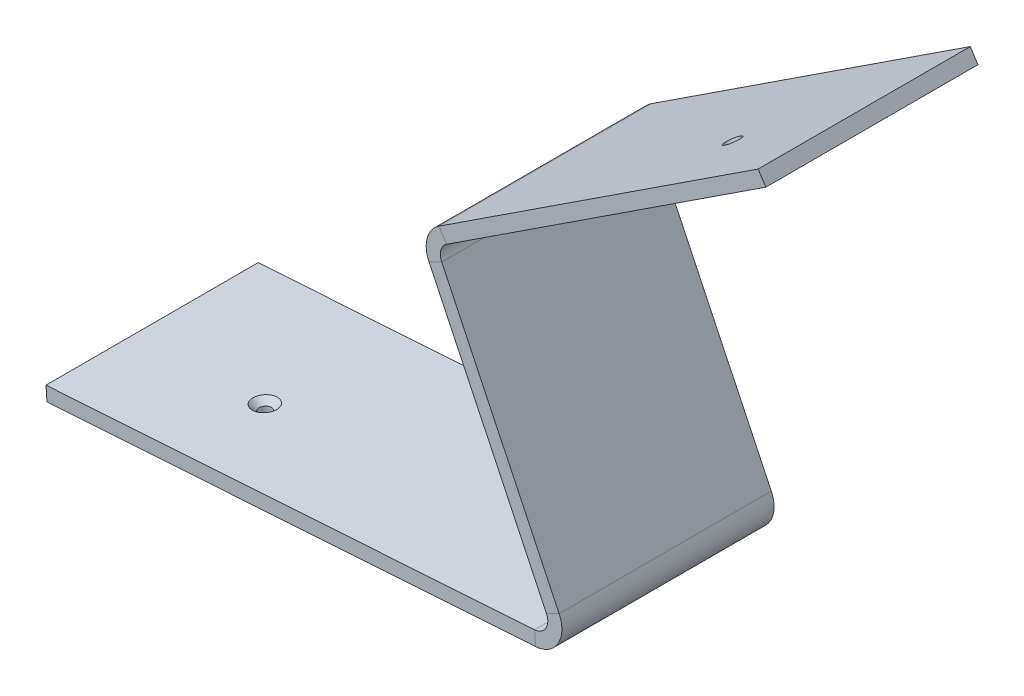
ISO-10303-21;
HEADER;
FILE_DESCRIPTION(('STEP AP214'),'2;1');
FILE_NAME('part.step','',(''),(''),'','','');
FILE_SCHEMA(('AUTOMOTIVE_DESIGN { 1 0 10303 214 1 1 1 1 }'));
ENDSEC;
DATA;
#1=APPLICATION_CONTEXT('core data for automotive mechanical design processes');
#2=APPLICATION_PROTOCOL_DEFINITION('international standard','automotive_design',2000,#1);
#3=PRODUCT_CONTEXT('',#1,'mechanical');
#4=PRODUCT('Part','Part','',(#3));
#5=PRODUCT_RELATED_PRODUCT_CATEGORY('part','',(#4));
#6=PRODUCT_DEFINITION_FORMATION('','',#4);
#7=PRODUCT_DEFINITION_CONTEXT('part definition',#1,'design');
#8=PRODUCT_DEFINITION('design','',#6,#7);
#9=PRODUCT_DEFINITION_SHAPE('','',#8);
#10=(LENGTH_UNIT() NAMED_UNIT(*) SI_UNIT(.MILLI.,.METRE.));
#11=(NAMED_UNIT(*) PLANE_ANGLE_UNIT() SI_UNIT($,.RADIAN.));
#12=(NAMED_UNIT(*) SI_UNIT($,.STERADIAN.) SOLID_ANGLE_UNIT());
#13=UNCERTAINTY_MEASURE_WITH_UNIT(LENGTH_MEASURE(1.E-05),#10,'distance_accuracy_value','');
#14=(GEOMETRIC_REPRESENTATION_CONTEXT(3) GLOBAL_UNCERTAINTY_ASSIGNED_CONTEXT((#13)) GLOBAL_UNIT_ASSIGNED_CONTEXT((#10,
#11,#12)) REPRESENTATION_CONTEXT('',''));
#15=CARTESIAN_POINT('',(0.,0.,0.));
#16=DIRECTION('',(0.,0.,1.));
#17=DIRECTION('',(1.,0.,0.));
#18=AXIS2_PLACEMENT_3D('',#15,#16,#17);
#19=CARTESIAN_POINT('',(50.2894061578181,-39.7342109267842,60.));
#20=DIRECTION('',(0.,0.,1.));
#21=DIRECTION('',(1.,0.,0.));
#22=AXIS2_PLACEMENT_3D('',#19,#20,#21);
#23=PLANE('',#22);
#24=DIRECTION('',(0.902204731894501,0.431308035801759,0.));
#25=VECTOR('',#24,1.);
#26=CARTESIAN_POINT('',(50.2894061578181,-39.7342109267842,60.));
#27=LINE('',#26,#25);
#28=CARTESIAN_POINT('',(50.2894061578181,-39.7342109267842,60.));
#29=VERTEX_POINT('',#28);
#30=CARTESIAN_POINT('',(53.8982250853961,-38.0089787835772,60.));
#31=VERTEX_POINT('',#30);
#32=EDGE_CURVE('E11',#29,#31,#27,.T.);
#33=ORIENTED_EDGE('',*,*,#32,.F.);
#34=CARTESIAN_POINT('',(46.6805872302401,-41.4594430699912,60.));
#35=DIRECTION('',(0.,0.,-1.));
#36=DIRECTION('',(-1.,0.,0.));
#37=AXIS2_PLACEMENT_3D('',#34,#35,#36);
#38=CIRCLE('',#37,4.);
#39=CARTESIAN_POINT('',(46.945285338165,-45.4506753247793,60.));
#40=VERTEX_POINT('',#39);
#41=EDGE_CURVE('E271',#40,#29,#38,.F.);
#42=ORIENTED_EDGE('',*,*,#41,.F.);
#43=DIRECTION('',(-0.0661745269812177,0.997808063697028,0.));
#44=VECTOR('',#43,1.);
#45=CARTESIAN_POINT('',(47.2099834460898,-49.4419075795675,60.));
#46=LINE('',#45,#44);
#47=CARTESIAN_POINT('',(47.2099834460898,-49.4419075795675,60.));
#48=VERTEX_POINT('',#47);
#49=EDGE_CURVE('E55',#48,#40,#46,.T.);
#50=ORIENTED_EDGE('',*,*,#49,.F.);
#51=CARTESIAN_POINT('',(46.6805872302401,-41.4594430699912,60.));
#52=DIRECTION('',(0.,0.,1.));
#53=DIRECTION('',(1.,0.,0.));
#54=AXIS2_PLACEMENT_3D('',#51,#52,#53);
#55=CIRCLE('',#54,8.);
#56=EDGE_CURVE('E157',#48,#31,#55,.T.);
#57=ORIENTED_EDGE('',*,*,#56,.T.);
#58=EDGE_LOOP('',(#33,#42,#50,#57));
#59=FACE_BOUND('',#58,.T.);
#60=ADVANCED_FACE('F46',(#59),#23,.T.);
#61=CARTESIAN_POINT('',(47.2099834460898,-49.4419075795675,60.));
#62=DIRECTION('',(0.,0.,1.));
#63=DIRECTION('',(1.,0.,0.));
#64=AXIS2_PLACEMENT_3D('',#61,#62,#63);
#65=PLANE('',#64);
#66=DIRECTION('',(-0.431308035801759,0.902204731894501,0.));
#67=VECTOR('',#66,1.);
#68=CARTESIAN_POINT('',(52.8354716674124,-45.0600387801869,60.));
#69=LINE('',#68,#67);
#70=CARTESIAN_POINT('',(17.0687583563425,29.7563228801671,60.));
#71=VERTEX_POINT('',#70);
#72=EDGE_CURVE('E151',#29,#71,#69,.T.);
#73=ORIENTED_EDGE('',*,*,#72,.F.);
#74=ORIENTED_EDGE('',*,*,#32,.T.);
#75=DIRECTION('',(-0.431308035801759,0.902204731894501,0.));
#76=VECTOR('',#75,1.);
#77=CARTESIAN_POINT('',(56.4442905949904,-43.3348066369798,60.));
#78=LINE('',#77,#76);
#79=CARTESIAN_POINT('',(20.6775772839205,31.4815550233742,60.));
#80=VERTEX_POINT('',#79);
#81=EDGE_CURVE('E148',#31,#80,#78,.T.);
#82=ORIENTED_EDGE('',*,*,#81,.T.);
#83=DIRECTION('',(-0.902204731894502,-0.431308035801757,0.));
#84=VECTOR('',#83,1.);
#85=CARTESIAN_POINT('',(20.6775772839205,31.4815550233742,60.));
#86=LINE('',#85,#84);
#87=EDGE_CURVE('E240',#80,#71,#86,.T.);
#88=ORIENTED_EDGE('',*,*,#87,.T.);
#89=EDGE_LOOP('',(#73,#74,#82,#88));
#90=FACE_BOUND('',#89,.T.);
#91=ADVANCED_FACE('F146',(#90),#65,.T.);
#92=CARTESIAN_POINT('',(46.945285338165,-45.4506753247793,0.));
#93=DIRECTION('',(0.,0.,-1.));
#94=DIRECTION('',(-1.,0.,0.));
#95=AXIS2_PLACEMENT_3D('',#92,#93,#94);
#96=PLANE('',#95);
#97=DIRECTION('',(0.0661745269812177,-0.997808063697028,0.));
#98=VECTOR('',#97,1.);
#99=CARTESIAN_POINT('',(46.945285338165,-45.4506753247793,0.));
#100=LINE('',#99,#98);
#101=CARTESIAN_POINT('',(46.945285338165,-45.4506753247793,0.));
#102=VERTEX_POINT('',#101);
#103=CARTESIAN_POINT('',(47.2099834460898,-49.4419075795675,0.));
#104=VERTEX_POINT('',#103);
#105=EDGE_CURVE('E245',#102,#104,#100,.T.);
#106=ORIENTED_EDGE('',*,*,#105,.F.);
#107=CARTESIAN_POINT('',(46.6805872302401,-41.4594430699912,0.));
#108=DIRECTION('',(0.,0.,-1.));
#109=DIRECTION('',(-1.,0.,0.));
#110=AXIS2_PLACEMENT_3D('',#107,#108,#109);
#111=CIRCLE('',#110,4.);
#112=CARTESIAN_POINT('',(50.2894061578181,-39.7342109267842,0.));
#113=VERTEX_POINT('',#112);
#114=EDGE_CURVE('E197',#102,#113,#111,.F.);
#115=ORIENTED_EDGE('',*,*,#114,.T.);
#116=DIRECTION('',(-0.902204731894501,-0.431308035801759,0.));
#117=VECTOR('',#116,1.);
#118=CARTESIAN_POINT('',(53.8982250853961,-38.0089787835772,0.));
#119=LINE('',#118,#117);
#120=CARTESIAN_POINT('',(53.8982250853961,-38.0089787835772,0.));
#121=VERTEX_POINT('',#120);
#122=EDGE_CURVE('E243',#121,#113,#119,.T.);
#123=ORIENTED_EDGE('',*,*,#122,.F.);
#124=CARTESIAN_POINT('',(46.6805872302401,-41.4594430699912,0.));
#125=DIRECTION('',(0.,0.,1.));
#126=DIRECTION('',(1.,0.,0.));
#127=AXIS2_PLACEMENT_3D('',#124,#125,#126);
#128=CIRCLE('',#127,8.);
#129=EDGE_CURVE('E169',#104,#121,#128,.T.);
#130=ORIENTED_EDGE('',*,*,#129,.F.);
#131=EDGE_LOOP('',(#106,#115,#123,#130));
#132=FACE_BOUND('',#131,.T.);
#133=ADVANCED_FACE('F289',(#132),#96,.T.);
#134=CARTESIAN_POINT('',(53.8982250853961,-38.0089787835772,0.));
#135=DIRECTION('',(0.,0.,-1.));
#136=DIRECTION('',(-1.,0.,0.));
#137=AXIS2_PLACEMENT_3D('',#134,#135,#136);
#138=PLANE('',#137);
#139=DIRECTION('',(0.997808063697029,0.0661745269812073,0.));
#140=VECTOR('',#139,1.);
#141=CARTESIAN_POINT('',(-91.2442365320208,-54.615390039187,0.));
#142=LINE('',#141,#140);
#143=CARTESIAN_POINT('',(-91.2442365320208,-54.615390039187,0.));
#144=VERTEX_POINT('',#143);
#145=EDGE_CURVE('E200',#144,#102,#142,.T.);
#146=ORIENTED_EDGE('',*,*,#145,.T.);
#147=ORIENTED_EDGE('',*,*,#105,.T.);
#148=DIRECTION('',(0.997808063697029,0.0661745269812073,0.));
#149=VECTOR('',#148,1.);
#150=CARTESIAN_POINT('',(-90.979538424096,-58.6066222939751,0.));
#151=LINE('',#150,#149);
#152=CARTESIAN_POINT('',(-90.979538424096,-58.6066222939751,0.));
#153=VERTEX_POINT('',#152);
#154=EDGE_CURVE('E206',#153,#104,#151,.T.);
#155=ORIENTED_EDGE('',*,*,#154,.F.);
#156=DIRECTION('',(-0.0661745269812074,0.997808063697029,0.));
#157=VECTOR('',#156,1.);
#158=CARTESIAN_POINT('',(-90.979538424096,-58.6066222939751,0.));
#159=LINE('',#158,#157);
#160=EDGE_CURVE('E203',#153,#144,#159,.T.);
#161=ORIENTED_EDGE('',*,*,#160,.T.);
#162=EDGE_LOOP('',(#146,#147,#155,#161));
#163=FACE_BOUND('',#162,.T.);
#164=ADVANCED_FACE('F338',(#163),#138,.T.);
#165=CARTESIAN_POINT('',(19.903130416915,39.8990947636686,60.));
#166=DIRECTION('',(0.,0.,1.));
#167=DIRECTION('',(1.,0.,0.));
#168=AXIS2_PLACEMENT_3D('',#165,#166,#167);
#169=PLANE('',#168);
#170=DIRECTION('',(0.547908224322945,-0.836538449635925,0.));
#171=VECTOR('',#170,1.);
#172=CARTESIAN_POINT('',(19.903130416915,39.8990947636686,60.));
#173=LINE('',#172,#171);
#174=CARTESIAN_POINT('',(19.903130416915,39.8990947636686,60.));
#175=VERTEX_POINT('',#174);
#176=CARTESIAN_POINT('',(22.0947633142068,36.5529409651249,60.));
#177=VERTEX_POINT('',#176);
#178=EDGE_CURVE('E64',#175,#177,#173,.T.);
#179=ORIENTED_EDGE('',*,*,#178,.F.);
#180=CARTESIAN_POINT('',(24.2863962114985,33.2067871665812,60.));
#181=DIRECTION('',(0.,0.,1.));
#182=DIRECTION('',(1.,0.,0.));
#183=AXIS2_PLACEMENT_3D('',#180,#181,#182);
#184=CIRCLE('',#183,8.);
#185=EDGE_CURVE('E267',#71,#175,#184,.F.);
#186=ORIENTED_EDGE('',*,*,#185,.F.);
#187=ORIENTED_EDGE('',*,*,#87,.F.);
#188=CARTESIAN_POINT('',(24.2863962114985,33.2067871665812,60.));
#189=DIRECTION('',(0.,0.,1.));
#190=DIRECTION('',(1.,0.,0.));
#191=AXIS2_PLACEMENT_3D('',#188,#189,#190);
#192=CIRCLE('',#191,4.);
#193=EDGE_CURVE('E177',#80,#177,#192,.F.);
#194=ORIENTED_EDGE('',*,*,#193,.T.);
#195=EDGE_LOOP('',(#179,#186,#187,#194));
#196=FACE_BOUND('',#195,.T.);
#197=ADVANCED_FACE('F343',(#196),#169,.T.);
#198=CARTESIAN_POINT('',(20.6775772839205,31.4815550233742,60.));
#199=DIRECTION('',(0.,0.,1.));
#200=DIRECTION('',(1.,0.,0.));
#201=AXIS2_PLACEMENT_3D('',#198,#199,#200);
#202=PLANE('',#201);
#203=DIRECTION('',(0.836538449635925,0.547908224322945,0.));
#204=VECTOR('',#203,1.);
#205=CARTESIAN_POINT('',(14.0519871455884,36.0667670070103,60.));
#206=LINE('',#205,#204);
#207=CARTESIAN_POINT('',(110.167579221413,99.0196694192464,60.));
#208=VERTEX_POINT('',#207);
#209=EDGE_CURVE('E264',#175,#208,#206,.T.);
#210=ORIENTED_EDGE('',*,*,#209,.F.);
#211=ORIENTED_EDGE('',*,*,#178,.T.);
#212=DIRECTION('',(0.836538449635925,0.547908224322945,0.));
#213=VECTOR('',#212,1.);
#214=CARTESIAN_POINT('',(16.2436200428802,32.7206132084666,60.));
#215=LINE('',#214,#213);
#216=CARTESIAN_POINT('',(112.359212118705,95.6735156207027,60.));
#217=VERTEX_POINT('',#216);
#218=EDGE_CURVE('E118',#177,#217,#215,.T.);
#219=ORIENTED_EDGE('',*,*,#218,.T.);
#220=DIRECTION('',(0.547908224322946,-0.836538449635924,0.));
#221=VECTOR('',#220,1.);
#222=CARTESIAN_POINT('',(110.167579221413,99.0196694192464,60.));
#223=LINE('',#222,#221);
#224=EDGE_CURVE('E261',#208,#217,#223,.T.);
#225=ORIENTED_EDGE('',*,*,#224,.F.);
#226=EDGE_LOOP('',(#210,#211,#219,#225));
#227=FACE_BOUND('',#226,.T.);
#228=ADVANCED_FACE('F316',(#227),#202,.T.);
#229=CARTESIAN_POINT('',(17.0687583563425,29.7563228801671,0.));
#230=DIRECTION('',(0.,0.,-1.));
#231=DIRECTION('',(-1.,0.,0.));
#232=AXIS2_PLACEMENT_3D('',#229,#230,#231);
#233=PLANE('',#232);
#234=DIRECTION('',(0.902204731894502,0.431308035801757,0.));
#235=VECTOR('',#234,1.);
#236=CARTESIAN_POINT('',(17.0687583563425,29.7563228801671,0.));
#237=LINE('',#236,#235);
#238=CARTESIAN_POINT('',(17.0687583563425,29.7563228801671,0.));
#239=VERTEX_POINT('',#238);
#240=CARTESIAN_POINT('',(20.6775772839205,31.4815550233742,0.));
#241=VERTEX_POINT('',#240);
#242=EDGE_CURVE('E105',#239,#241,#237,.T.);
#243=ORIENTED_EDGE('',*,*,#242,.F.);
#244=CARTESIAN_POINT('',(24.2863962114985,33.2067871665812,0.));
#245=DIRECTION('',(0.,0.,1.));
#246=DIRECTION('',(1.,0.,0.));
#247=AXIS2_PLACEMENT_3D('',#244,#245,#246);
#248=CIRCLE('',#247,8.);
#249=CARTESIAN_POINT('',(19.903130416915,39.8990947636686,0.));
#250=VERTEX_POINT('',#249);
#251=EDGE_CURVE('E193',#239,#250,#248,.F.);
#252=ORIENTED_EDGE('',*,*,#251,.T.);
#253=DIRECTION('',(-0.547908224322945,0.836538449635925,0.));
#254=VECTOR('',#253,1.);
#255=CARTESIAN_POINT('',(22.0947633142068,36.5529409651249,0.));
#256=LINE('',#255,#254);
#257=CARTESIAN_POINT('',(22.0947633142068,36.5529409651249,0.));
#258=VERTEX_POINT('',#257);
#259=EDGE_CURVE('E112',#258,#250,#256,.T.);
#260=ORIENTED_EDGE('',*,*,#259,.F.);
#261=CARTESIAN_POINT('',(24.2863962114985,33.2067871665812,0.));
#262=DIRECTION('',(0.,0.,1.));
#263=DIRECTION('',(1.,0.,0.));
#264=AXIS2_PLACEMENT_3D('',#261,#262,#263);
#265=CIRCLE('',#264,4.);
#266=EDGE_CURVE('E212',#241,#258,#265,.F.);
#267=ORIENTED_EDGE('',*,*,#266,.F.);
#268=EDGE_LOOP('',(#243,#252,#260,#267));
#269=FACE_BOUND('',#268,.T.);
#270=ADVANCED_FACE('F304',(#269),#233,.T.);
#271=CARTESIAN_POINT('',(22.0947633142068,36.5529409651249,0.));
#272=DIRECTION('',(0.,0.,-1.));
#273=DIRECTION('',(-1.,0.,0.));
#274=AXIS2_PLACEMENT_3D('',#271,#272,#273);
#275=PLANE('',#274);
#276=DIRECTION('',(-0.431308035801759,0.902204731894501,0.));
#277=VECTOR('',#276,1.);
#278=CARTESIAN_POINT('',(52.8354716674124,-45.0600387801869,0.));
#279=LINE('',#278,#277);
#280=EDGE_CURVE('E195',#113,#239,#279,.T.);
#281=ORIENTED_EDGE('',*,*,#280,.T.);
#282=ORIENTED_EDGE('',*,*,#242,.T.);
#283=DIRECTION('',(-0.431308035801759,0.902204731894501,0.));
#284=VECTOR('',#283,1.);
#285=CARTESIAN_POINT('',(56.4442905949904,-43.3348066369798,0.));
#286=LINE('',#285,#284);
#287=EDGE_CURVE('E210',#121,#241,#286,.T.);
#288=ORIENTED_EDGE('',*,*,#287,.F.);
#289=ORIENTED_EDGE('',*,*,#122,.T.);
#290=EDGE_LOOP('',(#281,#282,#288,#289));
#291=FACE_BOUND('',#290,.T.);
#292=ADVANCED_FACE('F291',(#291),#275,.T.);
#293=CARTESIAN_POINT('',(16.2436200428802,32.7206132084666,60.));
#294=DIRECTION('',(-0.547908224322945,0.836538449635925,0.));
#295=DIRECTION('',(-0.836538449635925,-0.547908224322945,0.));
#296=AXIS2_PLACEMENT_3D('',#293,#294,#295);
#297=PLANE('',#296);
#298=CARTESIAN_POINT('',(81.7247362595311,75.608829677852,36.598273193193));
#299=DIRECTION('',(0.547908224322945,-0.836538449635925,0.));
#300=DIRECTION('',(0.836538449635925,0.547908224322945,0.));
#301=AXIS2_PLACEMENT_3D('',#298,#299,#300);
#302=CIRCLE('',#301,4.7);
#303=CARTESIAN_POINT('',(85.65646697282,78.1839983321698,36.598273193193));
#304=VERTEX_POINT('',#303);
#305=EDGE_CURVE('E360',#304,#304,#302,.T.);
#306=ORIENTED_EDGE('',*,*,#305,.F.);
#307=EDGE_LOOP('',(#306));
#308=FACE_BOUND('',#307,.T.);
#309=DIRECTION('',(0.836538449635925,0.547908224322945,0.));
#310=VECTOR('',#309,1.);
#311=CARTESIAN_POINT('',(16.2436200428802,32.7206132084666,0.));
#312=LINE('',#311,#310);
#313=CARTESIAN_POINT('',(112.359212118705,95.6735156207027,0.));
#314=VERTEX_POINT('',#313);
#315=EDGE_CURVE('E183',#258,#314,#312,.T.);
#316=ORIENTED_EDGE('',*,*,#315,.T.);
#317=DIRECTION('',(0.,0.,-1.));
#318=VECTOR('',#317,1.);
#319=CARTESIAN_POINT('',(112.359212118705,95.6735156207027,60.));
#320=LINE('',#319,#318);
#321=EDGE_CURVE('E236',#217,#314,#320,.T.);
#322=ORIENTED_EDGE('',*,*,#321,.F.);
#323=ORIENTED_EDGE('',*,*,#218,.F.);
#324=DIRECTION('',(0.,0.,-1.));
#325=VECTOR('',#324,1.);
#326=CARTESIAN_POINT('',(22.0947633142068,36.5529409651249,60.));
#327=LINE('',#326,#325);
#328=EDGE_CURVE('E179',#177,#258,#327,.T.);
#329=ORIENTED_EDGE('',*,*,#328,.T.);
#330=EDGE_LOOP('',(#316,#322,#323,#329));
#331=FACE_BOUND('',#330,.T.);
#332=ADVANCED_FACE('F310',(#308,#331),#297,.F.);
#333=CARTESIAN_POINT('',(110.167579221413,99.0196694192464,60.));
#334=DIRECTION('',(0.836538449635925,0.547908224322946,0.));
#335=DIRECTION('',(-0.547908224322946,0.836538449635925,0.));
#336=AXIS2_PLACEMENT_3D('',#333,#334,#335);
#337=PLANE('',#336);
#338=DIRECTION('',(0.547908224322946,-0.836538449635924,0.));
#339=VECTOR('',#338,1.);
#340=CARTESIAN_POINT('',(110.167579221413,99.0196694192464,0.));
#341=LINE('',#340,#339);
#342=CARTESIAN_POINT('',(110.167579221413,99.0196694192464,0.));
#343=VERTEX_POINT('',#342);
#344=EDGE_CURVE('E186',#343,#314,#341,.T.);
#345=ORIENTED_EDGE('',*,*,#344,.F.);
#346=DIRECTION('',(0.,0.,-1.));
#347=VECTOR('',#346,1.);
#348=CARTESIAN_POINT('',(110.167579221413,99.0196694192464,60.));
#349=LINE('',#348,#347);
#350=EDGE_CURVE('E234',#208,#343,#349,.T.);
#351=ORIENTED_EDGE('',*,*,#350,.F.);
#352=ORIENTED_EDGE('',*,*,#224,.T.);
#353=ORIENTED_EDGE('',*,*,#321,.T.);
#354=EDGE_LOOP('',(#345,#351,#352,#353));
#355=FACE_BOUND('',#354,.T.);
#356=ADVANCED_FACE('F315',(#355),#337,.T.);
#357=CARTESIAN_POINT('',(14.0519871455884,36.0667670070103,60.));
#358=DIRECTION('',(-0.547908224322945,0.836538449635925,0.));
#359=DIRECTION('',(-0.836538449635925,-0.547908224322945,0.));
#360=AXIS2_PLACEMENT_3D('',#357,#358,#359);
#361=PLANE('',#360);
#362=CARTESIAN_POINT('',(79.5331033622394,78.9549834763957,36.598273193193));
#363=DIRECTION('',(-0.547908224322945,0.836538449635925,0.));
#364=DIRECTION('',(-0.836538449635925,-0.547908224322945,0.));
#365=AXIS2_PLACEMENT_3D('',#362,#363,#364);
#366=CIRCLE('',#365,2.24999999999999);
#367=CARTESIAN_POINT('',(77.6508918505586,77.7221899716691,36.598273193193));
#368=VERTEX_POINT('',#367);
#369=EDGE_CURVE('E49',#368,#368,#366,.T.);
#370=ORIENTED_EDGE('',*,*,#369,.F.);
#371=EDGE_LOOP('',(#370));
#372=FACE_BOUND('',#371,.T.);
#373=DIRECTION('',(0.836538449635925,0.547908224322945,0.));
#374=VECTOR('',#373,1.);
#375=CARTESIAN_POINT('',(14.0519871455884,36.0667670070103,0.));
#376=LINE('',#375,#374);
#377=EDGE_CURVE('E190',#250,#343,#376,.T.);
#378=ORIENTED_EDGE('',*,*,#377,.F.);
#379=DIRECTION('',(0.,0.,-1.));
#380=VECTOR('',#379,1.);
#381=CARTESIAN_POINT('',(19.903130416915,39.8990947636686,60.));
#382=LINE('',#381,#380);
#383=EDGE_CURVE('E231',#175,#250,#382,.T.);
#384=ORIENTED_EDGE('',*,*,#383,.F.);
#385=ORIENTED_EDGE('',*,*,#209,.T.);
#386=ORIENTED_EDGE('',*,*,#350,.T.);
#387=EDGE_LOOP('',(#378,#384,#385,#386));
#388=FACE_BOUND('',#387,.T.);
#389=ADVANCED_FACE('F318',(#372,#388),#361,.T.);
#390=CARTESIAN_POINT('',(24.2863962114985,33.2067871665812,60.));
#391=DIRECTION('',(0.,0.,-1.));
#392=DIRECTION('',(-1.,0.,0.));
#393=AXIS2_PLACEMENT_3D('',#390,#391,#392);
#394=CYLINDRICAL_SURFACE('',#393,8.);
#395=ORIENTED_EDGE('',*,*,#251,.F.);
#396=DIRECTION('',(0.,0.,-1.));
#397=VECTOR('',#396,1.);
#398=CARTESIAN_POINT('',(17.0687583563425,29.7563228801671,60.));
#399=LINE('',#398,#397);
#400=EDGE_CURVE('E228',#71,#239,#399,.T.);
#401=ORIENTED_EDGE('',*,*,#400,.F.);
#402=ORIENTED_EDGE('',*,*,#185,.T.);
#403=ORIENTED_EDGE('',*,*,#383,.T.);
#404=EDGE_LOOP('',(#395,#401,#402,#403));
#405=FACE_BOUND('',#404,.T.);
#406=ADVANCED_FACE('F301',(#405),#394,.T.);
#407=CARTESIAN_POINT('',(52.8354716674124,-45.0600387801869,60.));
#408=DIRECTION('',(-0.902204731894501,-0.431308035801759,0.));
#409=DIRECTION('',(0.431308035801759,-0.902204731894501,0.));
#410=AXIS2_PLACEMENT_3D('',#407,#408,#409);
#411=PLANE('',#410);
#412=ORIENTED_EDGE('',*,*,#280,.F.);
#413=DIRECTION('',(0.,0.,-1.));
#414=VECTOR('',#413,1.);
#415=CARTESIAN_POINT('',(50.2894061578181,-39.7342109267842,60.));
#416=LINE('',#415,#414);
#417=EDGE_CURVE('E225',#29,#113,#416,.T.);
#418=ORIENTED_EDGE('',*,*,#417,.F.);
#419=ORIENTED_EDGE('',*,*,#72,.T.);
#420=ORIENTED_EDGE('',*,*,#400,.T.);
#421=EDGE_LOOP('',(#412,#418,#419,#420));
#422=FACE_BOUND('',#421,.T.);
#423=ADVANCED_FACE('F296',(#422),#411,.T.);
#424=CARTESIAN_POINT('',(46.6805872302401,-41.4594430699912,60.));
#425=DIRECTION('',(0.,0.,-1.));
#426=DIRECTION('',(-1.,0.,0.));
#427=AXIS2_PLACEMENT_3D('',#424,#425,#426);
#428=CYLINDRICAL_SURFACE('',#427,4.);
#429=ORIENTED_EDGE('',*,*,#114,.F.);
#430=DIRECTION('',(0.,0.,-1.));
#431=VECTOR('',#430,1.);
#432=CARTESIAN_POINT('',(46.945285338165,-45.4506753247793,60.));
#433=LINE('',#432,#431);
#434=EDGE_CURVE('E222',#40,#102,#433,.T.);
#435=ORIENTED_EDGE('',*,*,#434,.F.);
#436=ORIENTED_EDGE('',*,*,#41,.T.);
#437=ORIENTED_EDGE('',*,*,#417,.T.);
#438=EDGE_LOOP('',(#429,#435,#436,#437));
#439=FACE_BOUND('',#438,.T.);
#440=ADVANCED_FACE('F294',(#439),#428,.F.);
#441=CARTESIAN_POINT('',(-91.2442365320208,-54.615390039187,60.));
#442=DIRECTION('',(-0.0661745269812073,0.997808063697029,0.));
#443=DIRECTION('',(-0.997808063697029,-0.0661745269812073,0.));
#444=AXIS2_PLACEMENT_3D('',#441,#442,#443);
#445=PLANE('',#444);
#446=CARTESIAN_POINT('',(-53.2288613209065,-52.0942143099714,36.126961684234));
#447=DIRECTION('',(-0.0661745269812073,0.997808063697029,0.));
#448=DIRECTION('',(-0.997808063697029,-0.0661745269812073,0.));
#449=AXIS2_PLACEMENT_3D('',#446,#447,#448);
#450=CIRCLE('',#449,3.36);
#451=CARTESIAN_POINT('',(-56.5814964149285,-52.3165607206282,36.126961684234));
#452=VERTEX_POINT('',#451);
#453=EDGE_CURVE('E252',#452,#452,#450,.T.);
#454=ORIENTED_EDGE('',*,*,#453,.F.);
#455=EDGE_LOOP('',(#454));
#456=FACE_BOUND('',#455,.T.);
#457=ORIENTED_EDGE('',*,*,#145,.F.);
#458=DIRECTION('',(0.,0.,-1.));
#459=VECTOR('',#458,1.);
#460=CARTESIAN_POINT('',(-91.2442365320208,-54.615390039187,60.));
#461=LINE('',#460,#459);
#462=CARTESIAN_POINT('',(-91.2442365320208,-54.615390039187,60.));
#463=VERTEX_POINT('',#462);
#464=EDGE_CURVE('E220',#463,#144,#461,.T.);
#465=ORIENTED_EDGE('',*,*,#464,.F.);
#466=DIRECTION('',(0.997808063697029,0.0661745269812073,0.));
#467=VECTOR('',#466,1.);
#468=CARTESIAN_POINT('',(-91.2442365320208,-54.615390039187,60.));
#469=LINE('',#468,#467);
#470=EDGE_CURVE('E273',#463,#40,#469,.T.);
#471=ORIENTED_EDGE('',*,*,#470,.T.);
#472=ORIENTED_EDGE('',*,*,#434,.T.);
#473=EDGE_LOOP('',(#457,#465,#471,#472));
#474=FACE_BOUND('',#473,.T.);
#475=ADVANCED_FACE('F401',(#456,#474),#445,.T.);
#476=CARTESIAN_POINT('',(-90.979538424096,-58.6066222939751,60.));
#477=DIRECTION('',(-0.997808063697029,-0.0661745269812074,0.));
#478=DIRECTION('',(0.0661745269812074,-0.997808063697029,0.));
#479=AXIS2_PLACEMENT_3D('',#476,#477,#478);
#480=PLANE('',#479);
#481=ORIENTED_EDGE('',*,*,#160,.F.);
#482=DIRECTION('',(0.,0.,-1.));
#483=VECTOR('',#482,1.);
#484=CARTESIAN_POINT('',(-90.979538424096,-58.6066222939751,60.));
#485=LINE('',#484,#483);
#486=CARTESIAN_POINT('',(-90.979538424096,-58.6066222939751,60.));
#487=VERTEX_POINT('',#486);
#488=EDGE_CURVE('E218',#487,#153,#485,.T.);
#489=ORIENTED_EDGE('',*,*,#488,.F.);
#490=DIRECTION('',(-0.0661745269812074,0.997808063697029,0.));
#491=VECTOR('',#490,1.);
#492=CARTESIAN_POINT('',(-90.979538424096,-58.6066222939751,60.));
#493=LINE('',#492,#491);
#494=EDGE_CURVE('E276',#487,#463,#493,.T.);
#495=ORIENTED_EDGE('',*,*,#494,.T.);
#496=ORIENTED_EDGE('',*,*,#464,.T.);
#497=EDGE_LOOP('',(#481,#489,#495,#496));
#498=FACE_BOUND('',#497,.T.);
#499=ADVANCED_FACE('F398',(#498),#480,.T.);
#500=CARTESIAN_POINT('',(-90.979538424096,-58.6066222939751,60.));
#501=DIRECTION('',(-0.0661745269812073,0.997808063697029,0.));
#502=DIRECTION('',(-0.997808063697029,-0.0661745269812073,0.));
#503=AXIS2_PLACEMENT_3D('',#500,#501,#502);
#504=PLANE('',#503);
#505=CARTESIAN_POINT('',(-52.9641632129817,-56.0854465647594,36.126961684234));
#506=DIRECTION('',(-0.0661745269812073,0.997808063697029,0.));
#507=DIRECTION('',(-0.997808063697029,-0.0661745269812073,0.));
#508=AXIS2_PLACEMENT_3D('',#505,#506,#507);
#509=CIRCLE('',#508,1.69999999999999);
#510=CARTESIAN_POINT('',(-54.6604369212666,-56.1979432606275,36.126961684234));
#511=VERTEX_POINT('',#510);
#512=EDGE_CURVE('E187',#511,#511,#509,.T.);
#513=ORIENTED_EDGE('',*,*,#512,.T.);
#514=EDGE_LOOP('',(#513));
#515=FACE_BOUND('',#514,.T.);
#516=ORIENTED_EDGE('',*,*,#154,.T.);
#517=DIRECTION('',(0.,0.,-1.));
#518=VECTOR('',#517,1.);
#519=CARTESIAN_POINT('',(47.2099834460898,-49.4419075795675,60.));
#520=LINE('',#519,#518);
#521=EDGE_CURVE('E171',#48,#104,#520,.T.);
#522=ORIENTED_EDGE('',*,*,#521,.F.);
#523=DIRECTION('',(0.997808063697029,0.0661745269812073,0.));
#524=VECTOR('',#523,1.);
#525=CARTESIAN_POINT('',(-90.979538424096,-58.6066222939751,60.));
#526=LINE('',#525,#524);
#527=EDGE_CURVE('E162',#487,#48,#526,.T.);
#528=ORIENTED_EDGE('',*,*,#527,.F.);
#529=ORIENTED_EDGE('',*,*,#488,.T.);
#530=EDGE_LOOP('',(#516,#522,#528,#529));
#531=FACE_BOUND('',#530,.T.);
#532=ADVANCED_FACE('F286',(#515,#531),#504,.F.);
#533=CARTESIAN_POINT('',(46.6805872302401,-41.4594430699912,60.));
#534=DIRECTION('',(0.,0.,-1.));
#535=DIRECTION('',(-1.,0.,0.));
#536=AXIS2_PLACEMENT_3D('',#533,#534,#535);
#537=CYLINDRICAL_SURFACE('',#536,8.);
#538=ORIENTED_EDGE('',*,*,#129,.T.);
#539=DIRECTION('',(0.,0.,-1.));
#540=VECTOR('',#539,1.);
#541=CARTESIAN_POINT('',(53.8982250853961,-38.0089787835772,60.));
#542=LINE('',#541,#540);
#543=EDGE_CURVE('E166',#31,#121,#542,.T.);
#544=ORIENTED_EDGE('',*,*,#543,.F.);
#545=ORIENTED_EDGE('',*,*,#56,.F.);
#546=ORIENTED_EDGE('',*,*,#521,.T.);
#547=EDGE_LOOP('',(#538,#544,#545,#546));
#548=FACE_BOUND('',#547,.T.);
#549=ADVANCED_FACE('F167',(#548),#537,.T.);
#550=CARTESIAN_POINT('',(56.4442905949904,-43.3348066369798,60.));
#551=DIRECTION('',(-0.902204731894501,-0.431308035801759,0.));
#552=DIRECTION('',(0.431308035801759,-0.902204731894501,0.));
#553=AXIS2_PLACEMENT_3D('',#550,#551,#552);
#554=PLANE('',#553);
#555=ORIENTED_EDGE('',*,*,#287,.T.);
#556=DIRECTION('',(0.,0.,-1.));
#557=VECTOR('',#556,1.);
#558=CARTESIAN_POINT('',(20.6775772839205,31.4815550233742,60.));
#559=LINE('',#558,#557);
#560=EDGE_CURVE('E172',#80,#241,#559,.T.);
#561=ORIENTED_EDGE('',*,*,#560,.F.);
#562=ORIENTED_EDGE('',*,*,#81,.F.);
#563=ORIENTED_EDGE('',*,*,#543,.T.);
#564=EDGE_LOOP('',(#555,#561,#562,#563));
#565=FACE_BOUND('',#564,.T.);
#566=ADVANCED_FACE('F174',(#565),#554,.F.);
#567=CARTESIAN_POINT('',(24.2863962114985,33.2067871665812,60.));
#568=DIRECTION('',(0.,0.,-1.));
#569=DIRECTION('',(-1.,0.,0.));
#570=AXIS2_PLACEMENT_3D('',#567,#568,#569);
#571=CYLINDRICAL_SURFACE('',#570,4.);
#572=ORIENTED_EDGE('',*,*,#266,.T.);
#573=ORIENTED_EDGE('',*,*,#328,.F.);
#574=ORIENTED_EDGE('',*,*,#193,.F.);
#575=ORIENTED_EDGE('',*,*,#560,.T.);
#576=EDGE_LOOP('',(#572,#573,#574,#575));
#577=FACE_BOUND('',#576,.T.);
#578=ADVANCED_FACE('F307',(#577),#571,.F.);
#579=CARTESIAN_POINT('',(24.2863962114985,33.2067871665812,60.));
#580=DIRECTION('',(0.,0.,1.));
#581=DIRECTION('',(1.,0.,0.));
#582=AXIS2_PLACEMENT_3D('',#579,#580,#581);
#583=PLANE('',#582);
#584=ORIENTED_EDGE('',*,*,#527,.T.);
#585=ORIENTED_EDGE('',*,*,#49,.T.);
#586=ORIENTED_EDGE('',*,*,#470,.F.);
#587=ORIENTED_EDGE('',*,*,#494,.F.);
#588=EDGE_LOOP('',(#584,#585,#586,#587));
#589=FACE_BOUND('',#588,.T.);
#590=ADVANCED_FACE('F282',(#589),#583,.T.);
#591=CARTESIAN_POINT('',(24.2863962114985,33.2067871665812,0.));
#592=DIRECTION('',(0.,0.,1.));
#593=DIRECTION('',(1.,0.,0.));
#594=AXIS2_PLACEMENT_3D('',#591,#592,#593);
#595=PLANE('',#594);
#596=ORIENTED_EDGE('',*,*,#315,.F.);
#597=ORIENTED_EDGE('',*,*,#259,.T.);
#598=ORIENTED_EDGE('',*,*,#377,.T.);
#599=ORIENTED_EDGE('',*,*,#344,.T.);
#600=EDGE_LOOP('',(#596,#597,#598,#599));
#601=FACE_BOUND('',#600,.T.);
#602=ADVANCED_FACE('F312',(#601),#595,.F.);
#603=CARTESIAN_POINT('',(-53.2288613209065,-52.0942143099714,36.126961684234));
#604=DIRECTION('',(-0.0661745269812073,0.997808063697029,0.));
#605=DIRECTION('',(-0.997808063697029,-0.0661745269812073,0.));
#606=AXIS2_PLACEMENT_3D('',#603,#604,#605);
#607=CYLINDRICAL_SURFACE('',#606,1.69999999999999);
#608=CARTESIAN_POINT('',(-53.1190116061177,-53.7505756957084,36.126961684234));
#609=DIRECTION('',(-0.0661745269812073,0.997808063697029,0.));
#610=DIRECTION('',(-0.997808063697029,-0.0661745269812073,0.));
#611=AXIS2_PLACEMENT_3D('',#608,#609,#610);
#612=CIRCLE('',#611,1.69999999999999);
#613=CARTESIAN_POINT('',(-54.8152853144026,-53.8630723915765,36.126961684234));
#614=VERTEX_POINT('',#613);
#615=EDGE_CURVE('E248',#614,#614,#612,.T.);
#616=ORIENTED_EDGE('',*,*,#615,.T.);
#617=EDGE_LOOP('',(#616));
#618=FACE_BOUND('',#617,.T.);
#619=ORIENTED_EDGE('',*,*,#512,.F.);
#620=EDGE_LOOP('',(#619));
#621=FACE_BOUND('',#620,.T.);
#622=ADVANCED_FACE('F380',(#618,#621),#607,.F.);
#623=CARTESIAN_POINT('',(-53.2288613209065,-52.0942143099714,36.126961684234));
#624=DIRECTION('',(-0.0661745269812073,0.997808063697029,0.));
#625=DIRECTION('',(-0.997808063697029,-0.0661745269812073,0.));
#626=AXIS2_PLACEMENT_3D('',#623,#624,#625);
#627=CONICAL_SURFACE('',#626,3.36,0.78539816339745);
#628=CARTESIAN_POINT('',(-54.8152853144026,-53.8630723915765,36.126961684234));
#629=CARTESIAN_POINT('',(-54.8336833466998,-53.8469628950041,36.126961684234));
#630=CARTESIAN_POINT('',(-54.8520813789969,-53.8308533984317,36.126961684234));
#631=CARTESIAN_POINT('',(-54.8888774435912,-53.798634405287,36.126961684234));
#632=CARTESIAN_POINT('',(-54.9072754758884,-53.7825249087146,36.126961684234));
#633=CARTESIAN_POINT('',(-54.9440715404826,-53.7503059155698,36.126961684234));
#634=CARTESIAN_POINT('',(-54.9624695727798,-53.7341964189975,36.126961684234));
#635=CARTESIAN_POINT('',(-54.9992656373741,-53.7019774258527,36.126961684234));
#636=CARTESIAN_POINT('',(-55.0176636696712,-53.6858679292803,36.126961684234));
#637=CARTESIAN_POINT('',(-55.0544597342655,-53.6536489361356,36.126961684234));
#638=CARTESIAN_POINT('',(-55.0728577665627,-53.6375394395632,36.126961684234));
#639=CARTESIAN_POINT('',(-55.1096538311569,-53.6053204464184,36.126961684234));
#640=CARTESIAN_POINT('',(-55.1280518634541,-53.5892109498461,36.126961684234));
#641=CARTESIAN_POINT('',(-55.1648479280484,-53.5569919567013,36.126961684234));
#642=CARTESIAN_POINT('',(-55.1832459603455,-53.5408824601289,36.126961684234));
#643=CARTESIAN_POINT('',(-55.2200420249398,-53.5086634669842,36.126961684234));
#644=CARTESIAN_POINT('',(-55.238440057237,-53.4925539704118,36.126961684234));
#645=CARTESIAN_POINT('',(-55.2752361218312,-53.460334977267,36.126961684234));
#646=CARTESIAN_POINT('',(-55.2936341541284,-53.4442254806947,36.126961684234));
#647=CARTESIAN_POINT('',(-55.3304302187227,-53.4120064875499,36.126961684234));
#648=CARTESIAN_POINT('',(-55.3488282510198,-53.3958969909775,36.126961684234));
#649=CARTESIAN_POINT('',(-55.3856243156141,-53.3636779978328,36.126961684234));
#650=CARTESIAN_POINT('',(-55.4040223479113,-53.3475685012604,36.126961684234));
#651=CARTESIAN_POINT('',(-55.4408184125055,-53.3153495081156,36.126961684234));
#652=CARTESIAN_POINT('',(-55.4592164448027,-53.2992400115433,36.126961684234));
#653=CARTESIAN_POINT('',(-55.496012509397,-53.2670210183985,36.126961684234));
#654=CARTESIAN_POINT('',(-55.5144105416941,-53.2509115218261,36.126961684234));
#655=CARTESIAN_POINT('',(-55.5512066062884,-53.2186925286814,36.126961684234));
#656=CARTESIAN_POINT('',(-55.5696046385856,-53.202583032109,36.126961684234));
#657=CARTESIAN_POINT('',(-55.6064007031799,-53.1703640389642,36.126961684234));
#658=CARTESIAN_POINT('',(-55.624798735477,-53.1542545423919,36.126961684234));
#659=CARTESIAN_POINT('',(-55.6615948000713,-53.1220355492471,36.126961684234));
#660=CARTESIAN_POINT('',(-55.6799928323684,-53.1059260526747,36.126961684234));
#661=CARTESIAN_POINT('',(-55.7167888969627,-53.07370705953,36.126961684234));
#662=CARTESIAN_POINT('',(-55.7351869292599,-53.0575975629576,36.126961684234));
#663=CARTESIAN_POINT('',(-55.7719829938542,-53.0253785698128,36.126961684234));
#664=CARTESIAN_POINT('',(-55.7903810261513,-53.0092690732405,36.126961684234));
#665=CARTESIAN_POINT('',(-55.8271770907456,-52.9770500800957,36.126961684234));
#666=CARTESIAN_POINT('',(-55.8455751230427,-52.9609405835233,36.126961684234));
#667=CARTESIAN_POINT('',(-55.882371187637,-52.9287215903786,36.126961684234));
#668=CARTESIAN_POINT('',(-55.9007692199342,-52.9126120938062,36.126961684234));
#669=CARTESIAN_POINT('',(-55.9375652845285,-52.8803931006614,36.126961684234));
#670=CARTESIAN_POINT('',(-55.9559633168256,-52.8642836040891,36.126961684234));
#671=CARTESIAN_POINT('',(-55.9927593814199,-52.8320646109443,36.126961684234));
#672=CARTESIAN_POINT('',(-56.011157413717,-52.8159551143719,36.126961684234));
#673=CARTESIAN_POINT('',(-56.0479534783113,-52.7837361212272,36.126961684234));
#674=CARTESIAN_POINT('',(-56.0663515106085,-52.7676266246548,36.126961684234));
#675=CARTESIAN_POINT('',(-56.1031475752028,-52.73540763151,36.126961684234));
#676=CARTESIAN_POINT('',(-56.1215456074999,-52.7192981349377,36.126961684234));
#677=CARTESIAN_POINT('',(-56.1583416720942,-52.6870791417929,36.126961684234));
#678=CARTESIAN_POINT('',(-56.1767397043913,-52.6709696452205,36.126961684234));
#679=CARTESIAN_POINT('',(-56.2135357689856,-52.6387506520758,36.126961684234));
#680=CARTESIAN_POINT('',(-56.2319338012828,-52.6226411555034,36.126961684234));
#681=CARTESIAN_POINT('',(-56.2687298658771,-52.5904221623586,36.126961684234));
#682=CARTESIAN_POINT('',(-56.2871278981742,-52.5743126657863,36.126961684234));
#683=CARTESIAN_POINT('',(-56.3239239627685,-52.5420936726415,36.126961684234));
#684=CARTESIAN_POINT('',(-56.3423219950656,-52.5259841760691,36.126961684234));
#685=CARTESIAN_POINT('',(-56.3791180596599,-52.4937651829244,36.126961684234));
#686=CARTESIAN_POINT('',(-56.3975160919571,-52.477655686352,36.126961684234));
#687=CARTESIAN_POINT('',(-56.4343121565514,-52.4454366932072,36.126961684234));
#688=CARTESIAN_POINT('',(-56.4527101888485,-52.4293271966349,36.126961684234));
#689=CARTESIAN_POINT('',(-56.4895062534428,-52.3971082034901,36.126961684234));
#690=CARTESIAN_POINT('',(-56.5079042857399,-52.3809987069177,36.126961684234));
#691=CARTESIAN_POINT('',(-56.5447003503342,-52.348779713773,36.126961684234));
#692=CARTESIAN_POINT('',(-56.5630983826314,-52.3326702172006,36.126961684234));
#693=CARTESIAN_POINT('',(-56.5814964149285,-52.3165607206282,36.126961684234));
#694=B_SPLINE_CURVE_WITH_KNOTS('',3,(#628,#629,#630,#631,#632,#633,#634,#635,#636,#637,#638,
#639,#640,#641,#642,#643,#644,#645,#646,#647,#648,#649,#650,#651,#652,#653,#654,#655,#656,#657,
#658,#659,#660,#661,#662,#663,#664,#665,#666,#667,#668,#669,#670,#671,#672,#673,#674,#675,#676,
#677,#678,#679,#680,#681,#682,#683,#684,#685,#686,#687,#688,#689,#690,#691,#692,#693),
.UNSPECIFIED.,.F.,.F.,(4,2,2,2,2,2,2,2,2,2,2,2,2,2,2,2,2,2,2,2,2,2,2,2,2,2,2,2,2,2,2,2,4),(0.,
0.0733623285481156,0.146724657096217,0.220086985644313,0.293449314192429,0.366811642740525,
0.440173971288631,0.513536299836742,0.586898628384838,0.660260956932949,0.733623285481049,
0.806985614029155,0.880347942577262,0.953710271125362,1.02707259967347,1.10043492822157,
1.17379725676967,1.24715958531778,1.32052191386588,1.39388424241399,1.46724657096209,
1.54060889951019,1.6139712280583,1.6873335566064,1.76069588515451,1.83405821370261,
1.90742054225071,1.98078287079883,2.05414519934693,2.12750752789503,2.20086985644314,
2.27423218499123,2.34759451353934),.UNSPECIFIED.);
#695=EDGE_CURVE('BSEAM372',#614,#452,#694,.T.);
#696=ORIENTED_EDGE('',*,*,#615,.F.);
#697=ORIENTED_EDGE('',*,*,#453,.T.);
#698=ORIENTED_EDGE('',*,*,#695,.T.);
#699=ORIENTED_EDGE('',*,*,#695,.F.);
#700=EDGE_LOOP('',(#696,#698,#697,#699));
#701=FACE_BOUND('',#700,.T.);
#702=ADVANCED_FACE('F372',(#701),#627,.F.);
#703=CARTESIAN_POINT('',(81.7247362595311,75.608829677852,36.598273193193));
#704=DIRECTION('',(0.547908224322945,-0.836538449635925,0.));
#705=DIRECTION('',(0.836538449635925,0.547908224322945,0.));
#706=AXIS2_PLACEMENT_3D('',#703,#704,#705);
#707=CYLINDRICAL_SURFACE('',#706,2.24999999999999);
#708=ORIENTED_EDGE('',*,*,#369,.T.);
#709=EDGE_LOOP('',(#708));
#710=FACE_BOUND('',#709,.T.);
#711=CARTESIAN_POINT('',(80.3823611099399,77.65834887946,36.598273193193));
#712=DIRECTION('',(0.547908224322945,-0.836538449635925,0.));
#713=DIRECTION('',(0.836538449635925,0.547908224322945,0.));
#714=AXIS2_PLACEMENT_3D('',#711,#712,#713);
#715=CIRCLE('',#714,2.25);
#716=CARTESIAN_POINT('',(82.2645726216207,78.8911423841867,36.598273193193));
#717=VERTEX_POINT('',#716);
#718=EDGE_CURVE('E362',#717,#717,#715,.T.);
#719=ORIENTED_EDGE('',*,*,#718,.T.);
#720=EDGE_LOOP('',(#719));
#721=FACE_BOUND('',#720,.T.);
#722=ADVANCED_FACE('F369',(#710,#721),#707,.F.);
#723=CARTESIAN_POINT('',(81.7247362595311,75.608829677852,36.598273193193));
#724=DIRECTION('',(0.547908224322945,-0.836538449635925,0.));
#725=DIRECTION('',(0.836538449635925,0.547908224322945,0.));
#726=AXIS2_PLACEMENT_3D('',#723,#724,#725);
#727=CONICAL_SURFACE('',#726,4.7,0.785398163397448);
#728=ORIENTED_EDGE('',*,*,#718,.F.);
#729=EDGE_LOOP('',(#728));
#730=FACE_BOUND('',#729,.T.);
#731=ORIENTED_EDGE('',*,*,#305,.T.);
#732=EDGE_LOOP('',(#731));
#733=FACE_BOUND('',#732,.T.);
#734=ADVANCED_FACE('F371',(#730,#733),#727,.F.);
#735=CLOSED_SHELL('',(#60,#91,#133,#164,#197,#228,#270,#292,#332,#356,#389,#406,#423,#440,#475,
#499,#532,#549,#566,#578,#590,#602,#622,#702,#722,#734));
#736=MANIFOLD_SOLID_BREP('B2',#735);
#737=ADVANCED_BREP_SHAPE_REPRESENTATION('',(#18,#736),#14);
#738=SHAPE_DEFINITION_REPRESENTATION(#9,#737);
ENDSEC;
END-ISO-10303-21;
